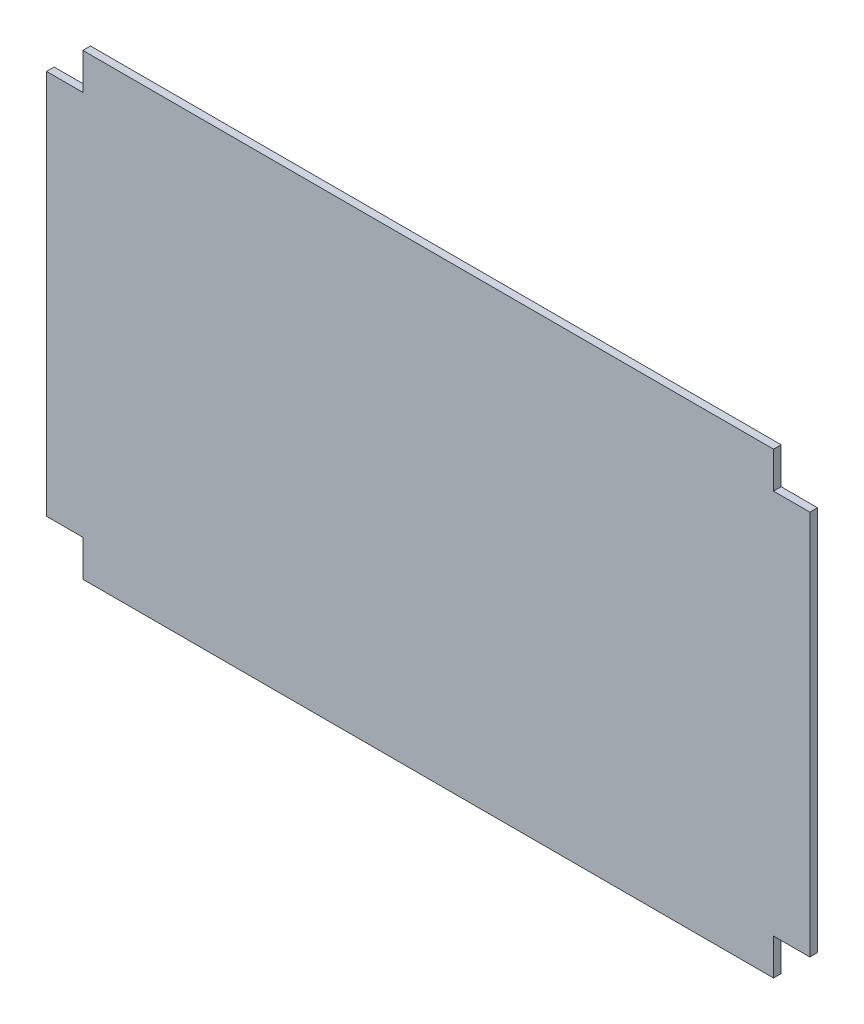
ISO-10303-21;
HEADER;
FILE_DESCRIPTION(('STEP AP214'),'2;1');
FILE_NAME('part.step','',(''),(''),'','','');
FILE_SCHEMA(('AUTOMOTIVE_DESIGN { 1 0 10303 214 1 1 1 1 }'));
ENDSEC;
DATA;
#1=APPLICATION_CONTEXT('core data for automotive mechanical design processes');
#2=APPLICATION_PROTOCOL_DEFINITION('international standard','automotive_design',2000,#1);
#3=PRODUCT_CONTEXT('',#1,'mechanical');
#4=PRODUCT('Part','Part','',(#3));
#5=PRODUCT_RELATED_PRODUCT_CATEGORY('part','',(#4));
#6=PRODUCT_DEFINITION_FORMATION('','',#4);
#7=PRODUCT_DEFINITION_CONTEXT('part definition',#1,'design');
#8=PRODUCT_DEFINITION('design','',#6,#7);
#9=PRODUCT_DEFINITION_SHAPE('','',#8);
#10=(LENGTH_UNIT() NAMED_UNIT(*) SI_UNIT(.MILLI.,.METRE.));
#11=(NAMED_UNIT(*) PLANE_ANGLE_UNIT() SI_UNIT($,.RADIAN.));
#12=(NAMED_UNIT(*) SI_UNIT($,.STERADIAN.) SOLID_ANGLE_UNIT());
#13=UNCERTAINTY_MEASURE_WITH_UNIT(LENGTH_MEASURE(1.E-05),#10,'distance_accuracy_value','');
#14=(GEOMETRIC_REPRESENTATION_CONTEXT(3) GLOBAL_UNCERTAINTY_ASSIGNED_CONTEXT((#13)) GLOBAL_UNIT_ASSIGNED_CONTEXT((#10,
#11,#12)) REPRESENTATION_CONTEXT('',''));
#15=CARTESIAN_POINT('',(0.,0.,0.));
#16=DIRECTION('',(0.,0.,1.));
#17=DIRECTION('',(1.,0.,0.));
#18=AXIS2_PLACEMENT_3D('',#15,#16,#17);
#19=CARTESIAN_POINT('',(635.,381.,12.7));
#20=DIRECTION('',(-1.,0.,0.));
#21=DIRECTION('',(0.,0.,1.));
#22=AXIS2_PLACEMENT_3D('',#19,#20,#21);
#23=PLANE('',#22);
#24=DIRECTION('',(0.,1.,0.));
#25=VECTOR('',#24,1.);
#26=CARTESIAN_POINT('',(635.,381.,12.7));
#27=LINE('',#26,#25);
#28=CARTESIAN_POINT('',(635.,-320.5,12.7));
#29=VERTEX_POINT('',#28);
#30=CARTESIAN_POINT('',(635.,320.5,12.7));
#31=VERTEX_POINT('',#30);
#32=EDGE_CURVE('E166',#29,#31,#27,.T.);
#33=ORIENTED_EDGE('',*,*,#32,.F.);
#34=DIRECTION('',(0.,0.,1.));
#35=VECTOR('',#34,1.);
#36=CARTESIAN_POINT('',(635.,-320.5,0.));
#37=LINE('',#36,#35);
#38=CARTESIAN_POINT('',(635.,-320.5,0.));
#39=VERTEX_POINT('',#38);
#40=EDGE_CURVE('E281',#39,#29,#37,.T.);
#41=ORIENTED_EDGE('',*,*,#40,.F.);
#42=DIRECTION('',(0.,1.,0.));
#43=VECTOR('',#42,1.);
#44=CARTESIAN_POINT('',(635.,381.,0.));
#45=LINE('',#44,#43);
#46=CARTESIAN_POINT('',(635.,320.5,0.));
#47=VERTEX_POINT('',#46);
#48=EDGE_CURVE('E175',#39,#47,#45,.T.);
#49=ORIENTED_EDGE('',*,*,#48,.T.);
#50=DIRECTION('',(0.,0.,1.));
#51=VECTOR('',#50,1.);
#52=CARTESIAN_POINT('',(635.,320.5,0.));
#53=LINE('',#52,#51);
#54=EDGE_CURVE('E148',#47,#31,#53,.T.);
#55=ORIENTED_EDGE('',*,*,#54,.T.);
#56=EDGE_LOOP('',(#33,#41,#49,#55));
#57=FACE_BOUND('',#56,.T.);
#58=ADVANCED_FACE('F45',(#57),#23,.F.);
#59=CARTESIAN_POINT('',(-635.,381.,12.7));
#60=DIRECTION('',(0.,-1.,0.));
#61=DIRECTION('',(0.,0.,-1.));
#62=AXIS2_PLACEMENT_3D('',#59,#60,#61);
#63=PLANE('',#62);
#64=DIRECTION('',(-1.,0.,0.));
#65=VECTOR('',#64,1.);
#66=CARTESIAN_POINT('',(-635.,381.,12.7));
#67=LINE('',#66,#65);
#68=CARTESIAN_POINT('',(574.5,381.,12.7));
#69=VERTEX_POINT('',#68);
#70=CARTESIAN_POINT('',(-574.5,381.,12.7));
#71=VERTEX_POINT('',#70);
#72=EDGE_CURVE('E156',#69,#71,#67,.T.);
#73=ORIENTED_EDGE('',*,*,#72,.F.);
#74=DIRECTION('',(0.,0.,1.));
#75=VECTOR('',#74,1.);
#76=CARTESIAN_POINT('',(574.5,381.,0.));
#77=LINE('',#76,#75);
#78=CARTESIAN_POINT('',(574.5,381.,0.));
#79=VERTEX_POINT('',#78);
#80=EDGE_CURVE('E136',#79,#69,#77,.T.);
#81=ORIENTED_EDGE('',*,*,#80,.F.);
#82=DIRECTION('',(-1.,0.,0.));
#83=VECTOR('',#82,1.);
#84=CARTESIAN_POINT('',(-635.,381.,0.));
#85=LINE('',#84,#83);
#86=CARTESIAN_POINT('',(-574.5,381.,0.));
#87=VERTEX_POINT('',#86);
#88=EDGE_CURVE('E179',#79,#87,#85,.T.);
#89=ORIENTED_EDGE('',*,*,#88,.T.);
#90=DIRECTION('',(0.,0.,1.));
#91=VECTOR('',#90,1.);
#92=CARTESIAN_POINT('',(-574.5,381.,0.));
#93=LINE('',#92,#91);
#94=EDGE_CURVE('E164',#87,#71,#93,.T.);
#95=ORIENTED_EDGE('',*,*,#94,.T.);
#96=EDGE_LOOP('',(#73,#81,#89,#95));
#97=FACE_BOUND('',#96,.T.);
#98=ADVANCED_FACE('F163',(#97),#63,.F.);
#99=CARTESIAN_POINT('',(-635.,381.,12.7));
#100=DIRECTION('',(1.,0.,0.));
#101=DIRECTION('',(0.,1.,0.));
#102=AXIS2_PLACEMENT_3D('',#99,#100,#101);
#103=PLANE('',#102);
#104=DIRECTION('',(0.,-1.,0.));
#105=VECTOR('',#104,1.);
#106=CARTESIAN_POINT('',(-635.,381.,0.));
#107=LINE('',#106,#105);
#108=CARTESIAN_POINT('',(-635.,320.5,0.));
#109=VERTEX_POINT('',#108);
#110=CARTESIAN_POINT('',(-635.,-320.5,0.));
#111=VERTEX_POINT('',#110);
#112=EDGE_CURVE('E181',#109,#111,#107,.T.);
#113=ORIENTED_EDGE('',*,*,#112,.T.);
#114=DIRECTION('',(0.,0.,1.));
#115=VECTOR('',#114,1.);
#116=CARTESIAN_POINT('',(-635.,-320.5,0.));
#117=LINE('',#116,#115);
#118=CARTESIAN_POINT('',(-635.,-320.5,12.7));
#119=VERTEX_POINT('',#118);
#120=EDGE_CURVE('E220',#111,#119,#117,.T.);
#121=ORIENTED_EDGE('',*,*,#120,.T.);
#122=DIRECTION('',(0.,-1.,0.));
#123=VECTOR('',#122,1.);
#124=CARTESIAN_POINT('',(-635.,381.,12.7));
#125=LINE('',#124,#123);
#126=CARTESIAN_POINT('',(-635.,320.5,12.7));
#127=VERTEX_POINT('',#126);
#128=EDGE_CURVE('E54',#127,#119,#125,.T.);
#129=ORIENTED_EDGE('',*,*,#128,.F.);
#130=DIRECTION('',(0.,0.,1.));
#131=VECTOR('',#130,1.);
#132=CARTESIAN_POINT('',(-635.,320.5,0.));
#133=LINE('',#132,#131);
#134=EDGE_CURVE('E244',#109,#127,#133,.T.);
#135=ORIENTED_EDGE('',*,*,#134,.F.);
#136=EDGE_LOOP('',(#113,#121,#129,#135));
#137=FACE_BOUND('',#136,.T.);
#138=ADVANCED_FACE('F260',(#137),#103,.F.);
#139=CARTESIAN_POINT('',(-635.,-381.,12.7));
#140=DIRECTION('',(0.,1.,0.));
#141=DIRECTION('',(0.,0.,1.));
#142=AXIS2_PLACEMENT_3D('',#139,#140,#141);
#143=PLANE('',#142);
#144=DIRECTION('',(1.,0.,0.));
#145=VECTOR('',#144,1.);
#146=CARTESIAN_POINT('',(-635.,-381.,12.7));
#147=LINE('',#146,#145);
#148=CARTESIAN_POINT('',(-574.5,-381.,12.7));
#149=VERTEX_POINT('',#148);
#150=CARTESIAN_POINT('',(574.5,-381.,12.7));
#151=VERTEX_POINT('',#150);
#152=EDGE_CURVE('E11',#149,#151,#147,.T.);
#153=ORIENTED_EDGE('',*,*,#152,.F.);
#154=DIRECTION('',(0.,0.,1.));
#155=VECTOR('',#154,1.);
#156=CARTESIAN_POINT('',(-574.5,-381.,0.));
#157=LINE('',#156,#155);
#158=CARTESIAN_POINT('',(-574.5,-381.,0.));
#159=VERTEX_POINT('',#158);
#160=EDGE_CURVE('E197',#159,#149,#157,.T.);
#161=ORIENTED_EDGE('',*,*,#160,.F.);
#162=DIRECTION('',(1.,0.,0.));
#163=VECTOR('',#162,1.);
#164=CARTESIAN_POINT('',(-635.,-381.,0.));
#165=LINE('',#164,#163);
#166=CARTESIAN_POINT('',(574.5,-381.,0.));
#167=VERTEX_POINT('',#166);
#168=EDGE_CURVE('E48',#159,#167,#165,.T.);
#169=ORIENTED_EDGE('',*,*,#168,.T.);
#170=DIRECTION('',(0.,0.,1.));
#171=VECTOR('',#170,1.);
#172=CARTESIAN_POINT('',(574.5,-381.,0.));
#173=LINE('',#172,#171);
#174=EDGE_CURVE('E196',#167,#151,#173,.T.);
#175=ORIENTED_EDGE('',*,*,#174,.T.);
#176=EDGE_LOOP('',(#153,#161,#169,#175));
#177=FACE_BOUND('',#176,.T.);
#178=ADVANCED_FACE('F195',(#177),#143,.F.);
#179=CARTESIAN_POINT('',(0.,0.,12.7));
#180=DIRECTION('',(0.,0.,1.));
#181=DIRECTION('',(1.,0.,0.));
#182=AXIS2_PLACEMENT_3D('',#179,#180,#181);
#183=PLANE('',#182);
#184=DIRECTION('',(-1.,0.,0.));
#185=VECTOR('',#184,1.);
#186=CARTESIAN_POINT('',(-635.,-320.5,12.7));
#187=LINE('',#186,#185);
#188=CARTESIAN_POINT('',(-574.5,-320.5,12.7));
#189=VERTEX_POINT('',#188);
#190=EDGE_CURVE('E223',#189,#119,#187,.T.);
#191=ORIENTED_EDGE('',*,*,#190,.F.);
#192=DIRECTION('',(0.,1.,0.));
#193=VECTOR('',#192,1.);
#194=CARTESIAN_POINT('',(-574.5,-320.5,12.7));
#195=LINE('',#194,#193);
#196=EDGE_CURVE('E226',#149,#189,#195,.T.);
#197=ORIENTED_EDGE('',*,*,#196,.F.);
#198=ORIENTED_EDGE('',*,*,#152,.T.);
#199=DIRECTION('',(0.,-1.,0.));
#200=VECTOR('',#199,1.);
#201=CARTESIAN_POINT('',(574.5,-381.,12.7));
#202=LINE('',#201,#200);
#203=CARTESIAN_POINT('',(574.5,-320.5,12.7));
#204=VERTEX_POINT('',#203);
#205=EDGE_CURVE('E149',#204,#151,#202,.T.);
#206=ORIENTED_EDGE('',*,*,#205,.F.);
#207=DIRECTION('',(-1.,0.,0.));
#208=VECTOR('',#207,1.);
#209=CARTESIAN_POINT('',(574.5,-320.5,12.7));
#210=LINE('',#209,#208);
#211=EDGE_CURVE('E206',#29,#204,#210,.T.);
#212=ORIENTED_EDGE('',*,*,#211,.F.);
#213=ORIENTED_EDGE('',*,*,#32,.T.);
#214=DIRECTION('',(1.,0.,0.));
#215=VECTOR('',#214,1.);
#216=CARTESIAN_POINT('',(574.5,320.5,12.7));
#217=LINE('',#216,#215);
#218=CARTESIAN_POINT('',(574.5,320.5,12.7));
#219=VERTEX_POINT('',#218);
#220=EDGE_CURVE('E158',#219,#31,#217,.T.);
#221=ORIENTED_EDGE('',*,*,#220,.F.);
#222=DIRECTION('',(0.,-1.,0.));
#223=VECTOR('',#222,1.);
#224=CARTESIAN_POINT('',(574.5,381.,12.7));
#225=LINE('',#224,#223);
#226=EDGE_CURVE('E139',#69,#219,#225,.T.);
#227=ORIENTED_EDGE('',*,*,#226,.F.);
#228=ORIENTED_EDGE('',*,*,#72,.T.);
#229=DIRECTION('',(0.,1.,0.));
#230=VECTOR('',#229,1.);
#231=CARTESIAN_POINT('',(-574.5,320.5,12.7));
#232=LINE('',#231,#230);
#233=CARTESIAN_POINT('',(-574.5,320.5,12.7));
#234=VERTEX_POINT('',#233);
#235=EDGE_CURVE('E240',#234,#71,#232,.T.);
#236=ORIENTED_EDGE('',*,*,#235,.F.);
#237=DIRECTION('',(1.,0.,0.));
#238=VECTOR('',#237,1.);
#239=CARTESIAN_POINT('',(-635.,320.5,12.7));
#240=LINE('',#239,#238);
#241=EDGE_CURVE('E160',#127,#234,#240,.T.);
#242=ORIENTED_EDGE('',*,*,#241,.F.);
#243=ORIENTED_EDGE('',*,*,#128,.T.);
#244=EDGE_LOOP('',(#191,#197,#198,#206,#212,#213,#221,#227,#228,#236,#242,#243));
#245=FACE_BOUND('',#244,.T.);
#246=ADVANCED_FACE('F154',(#245),#183,.T.);
#247=CARTESIAN_POINT('',(0.,0.,0.));
#248=DIRECTION('',(0.,0.,1.));
#249=DIRECTION('',(1.,0.,0.));
#250=AXIS2_PLACEMENT_3D('',#247,#248,#249);
#251=PLANE('',#250);
#252=DIRECTION('',(0.,1.,0.));
#253=VECTOR('',#252,1.);
#254=CARTESIAN_POINT('',(-574.5,-320.5,0.));
#255=LINE('',#254,#253);
#256=CARTESIAN_POINT('',(-574.5,-320.5,0.));
#257=VERTEX_POINT('',#256);
#258=EDGE_CURVE('E201',#159,#257,#255,.T.);
#259=ORIENTED_EDGE('',*,*,#258,.T.);
#260=DIRECTION('',(-1.,0.,0.));
#261=VECTOR('',#260,1.);
#262=CARTESIAN_POINT('',(-635.,-320.5,0.));
#263=LINE('',#262,#261);
#264=EDGE_CURVE('E62',#257,#111,#263,.T.);
#265=ORIENTED_EDGE('',*,*,#264,.T.);
#266=ORIENTED_EDGE('',*,*,#112,.F.);
#267=DIRECTION('',(1.,0.,0.));
#268=VECTOR('',#267,1.);
#269=CARTESIAN_POINT('',(-635.,320.5,0.));
#270=LINE('',#269,#268);
#271=CARTESIAN_POINT('',(-574.5,320.5,0.));
#272=VERTEX_POINT('',#271);
#273=EDGE_CURVE('E235',#109,#272,#270,.T.);
#274=ORIENTED_EDGE('',*,*,#273,.T.);
#275=DIRECTION('',(0.,1.,0.));
#276=VECTOR('',#275,1.);
#277=CARTESIAN_POINT('',(-574.5,320.5,0.));
#278=LINE('',#277,#276);
#279=EDGE_CURVE('E239',#272,#87,#278,.T.);
#280=ORIENTED_EDGE('',*,*,#279,.T.);
#281=ORIENTED_EDGE('',*,*,#88,.F.);
#282=DIRECTION('',(0.,-1.,0.));
#283=VECTOR('',#282,1.);
#284=CARTESIAN_POINT('',(574.5,381.,0.));
#285=LINE('',#284,#283);
#286=CARTESIAN_POINT('',(574.5,320.5,0.));
#287=VERTEX_POINT('',#286);
#288=EDGE_CURVE('E142',#79,#287,#285,.T.);
#289=ORIENTED_EDGE('',*,*,#288,.T.);
#290=DIRECTION('',(1.,0.,0.));
#291=VECTOR('',#290,1.);
#292=CARTESIAN_POINT('',(574.5,320.5,0.));
#293=LINE('',#292,#291);
#294=EDGE_CURVE('E403',#287,#47,#293,.T.);
#295=ORIENTED_EDGE('',*,*,#294,.T.);
#296=ORIENTED_EDGE('',*,*,#48,.F.);
#297=DIRECTION('',(-1.,0.,0.));
#298=VECTOR('',#297,1.);
#299=CARTESIAN_POINT('',(574.5,-320.5,0.));
#300=LINE('',#299,#298);
#301=CARTESIAN_POINT('',(574.5,-320.5,0.));
#302=VERTEX_POINT('',#301);
#303=EDGE_CURVE('E204',#39,#302,#300,.T.);
#304=ORIENTED_EDGE('',*,*,#303,.T.);
#305=DIRECTION('',(0.,-1.,0.));
#306=VECTOR('',#305,1.);
#307=CARTESIAN_POINT('',(574.5,-381.,0.));
#308=LINE('',#307,#306);
#309=EDGE_CURVE('E70',#302,#167,#308,.T.);
#310=ORIENTED_EDGE('',*,*,#309,.T.);
#311=ORIENTED_EDGE('',*,*,#168,.F.);
#312=EDGE_LOOP('',(#259,#265,#266,#274,#280,#281,#289,#295,#296,#304,#310,#311));
#313=FACE_BOUND('',#312,.T.);
#314=ADVANCED_FACE('F200',(#313),#251,.F.);
#315=CARTESIAN_POINT('',(-574.5,320.5,0.));
#316=DIRECTION('',(1.,0.,0.));
#317=DIRECTION('',(0.,0.,-1.));
#318=AXIS2_PLACEMENT_3D('',#315,#316,#317);
#319=PLANE('',#318);
#320=ORIENTED_EDGE('',*,*,#235,.T.);
#321=ORIENTED_EDGE('',*,*,#94,.F.);
#322=ORIENTED_EDGE('',*,*,#279,.F.);
#323=DIRECTION('',(0.,0.,1.));
#324=VECTOR('',#323,1.);
#325=CARTESIAN_POINT('',(-574.5,320.5,0.));
#326=LINE('',#325,#324);
#327=EDGE_CURVE('E252',#272,#234,#326,.T.);
#328=ORIENTED_EDGE('',*,*,#327,.T.);
#329=EDGE_LOOP('',(#320,#321,#322,#328));
#330=FACE_BOUND('',#329,.T.);
#331=ADVANCED_FACE('F263',(#330),#319,.F.);
#332=CARTESIAN_POINT('',(-635.,320.5,0.));
#333=DIRECTION('',(0.,-1.,0.));
#334=DIRECTION('',(0.,0.,-1.));
#335=AXIS2_PLACEMENT_3D('',#332,#333,#334);
#336=PLANE('',#335);
#337=ORIENTED_EDGE('',*,*,#241,.T.);
#338=ORIENTED_EDGE('',*,*,#327,.F.);
#339=ORIENTED_EDGE('',*,*,#273,.F.);
#340=ORIENTED_EDGE('',*,*,#134,.T.);
#341=EDGE_LOOP('',(#337,#338,#339,#340));
#342=FACE_BOUND('',#341,.T.);
#343=ADVANCED_FACE('F257',(#342),#336,.F.);
#344=CARTESIAN_POINT('',(574.5,381.,0.));
#345=DIRECTION('',(-1.,0.,0.));
#346=DIRECTION('',(0.,0.,1.));
#347=AXIS2_PLACEMENT_3D('',#344,#345,#346);
#348=PLANE('',#347);
#349=ORIENTED_EDGE('',*,*,#226,.T.);
#350=DIRECTION('',(0.,0.,1.));
#351=VECTOR('',#350,1.);
#352=CARTESIAN_POINT('',(574.5,320.5,0.));
#353=LINE('',#352,#351);
#354=EDGE_CURVE('E399',#287,#219,#353,.T.);
#355=ORIENTED_EDGE('',*,*,#354,.F.);
#356=ORIENTED_EDGE('',*,*,#288,.F.);
#357=ORIENTED_EDGE('',*,*,#80,.T.);
#358=EDGE_LOOP('',(#349,#355,#356,#357));
#359=FACE_BOUND('',#358,.T.);
#360=ADVANCED_FACE('F138',(#359),#348,.F.);
#361=CARTESIAN_POINT('',(574.5,320.5,0.));
#362=DIRECTION('',(0.,-1.,0.));
#363=DIRECTION('',(0.,0.,-1.));
#364=AXIS2_PLACEMENT_3D('',#361,#362,#363);
#365=PLANE('',#364);
#366=ORIENTED_EDGE('',*,*,#220,.T.);
#367=ORIENTED_EDGE('',*,*,#54,.F.);
#368=ORIENTED_EDGE('',*,*,#294,.F.);
#369=ORIENTED_EDGE('',*,*,#354,.T.);
#370=EDGE_LOOP('',(#366,#367,#368,#369));
#371=FACE_BOUND('',#370,.T.);
#372=ADVANCED_FACE('F296',(#371),#365,.F.);
#373=CARTESIAN_POINT('',(574.5,-381.,0.));
#374=DIRECTION('',(-1.,0.,0.));
#375=DIRECTION('',(0.,-1.,0.));
#376=AXIS2_PLACEMENT_3D('',#373,#374,#375);
#377=PLANE('',#376);
#378=ORIENTED_EDGE('',*,*,#205,.T.);
#379=ORIENTED_EDGE('',*,*,#174,.F.);
#380=ORIENTED_EDGE('',*,*,#309,.F.);
#381=DIRECTION('',(0.,0.,1.));
#382=VECTOR('',#381,1.);
#383=CARTESIAN_POINT('',(574.5,-320.5,0.));
#384=LINE('',#383,#382);
#385=EDGE_CURVE('E230',#302,#204,#384,.T.);
#386=ORIENTED_EDGE('',*,*,#385,.T.);
#387=EDGE_LOOP('',(#378,#379,#380,#386));
#388=FACE_BOUND('',#387,.T.);
#389=ADVANCED_FACE('F294',(#388),#377,.F.);
#390=CARTESIAN_POINT('',(574.5,-320.5,0.));
#391=DIRECTION('',(0.,1.,0.));
#392=DIRECTION('',(0.,0.,1.));
#393=AXIS2_PLACEMENT_3D('',#390,#391,#392);
#394=PLANE('',#393);
#395=ORIENTED_EDGE('',*,*,#211,.T.);
#396=ORIENTED_EDGE('',*,*,#385,.F.);
#397=ORIENTED_EDGE('',*,*,#303,.F.);
#398=ORIENTED_EDGE('',*,*,#40,.T.);
#399=EDGE_LOOP('',(#395,#396,#397,#398));
#400=FACE_BOUND('',#399,.T.);
#401=ADVANCED_FACE('F285',(#400),#394,.F.);
#402=CARTESIAN_POINT('',(-635.,-320.5,0.));
#403=DIRECTION('',(0.,1.,0.));
#404=DIRECTION('',(0.,0.,1.));
#405=AXIS2_PLACEMENT_3D('',#402,#403,#404);
#406=PLANE('',#405);
#407=ORIENTED_EDGE('',*,*,#190,.T.);
#408=ORIENTED_EDGE('',*,*,#120,.F.);
#409=ORIENTED_EDGE('',*,*,#264,.F.);
#410=DIRECTION('',(0.,0.,1.));
#411=VECTOR('',#410,1.);
#412=CARTESIAN_POINT('',(-574.5,-320.5,0.));
#413=LINE('',#412,#411);
#414=EDGE_CURVE('E217',#257,#189,#413,.T.);
#415=ORIENTED_EDGE('',*,*,#414,.T.);
#416=EDGE_LOOP('',(#407,#408,#409,#415));
#417=FACE_BOUND('',#416,.T.);
#418=ADVANCED_FACE('F261',(#417),#406,.F.);
#419=CARTESIAN_POINT('',(-574.5,-320.5,0.));
#420=DIRECTION('',(1.,0.,0.));
#421=DIRECTION('',(0.,0.,-1.));
#422=AXIS2_PLACEMENT_3D('',#419,#420,#421);
#423=PLANE('',#422);
#424=ORIENTED_EDGE('',*,*,#196,.T.);
#425=ORIENTED_EDGE('',*,*,#414,.F.);
#426=ORIENTED_EDGE('',*,*,#258,.F.);
#427=ORIENTED_EDGE('',*,*,#160,.T.);
#428=EDGE_LOOP('',(#424,#425,#426,#427));
#429=FACE_BOUND('',#428,.T.);
#430=ADVANCED_FACE('F307',(#429),#423,.F.);
#431=CLOSED_SHELL('',(#58,#98,#138,#178,#246,#314,#331,#343,#360,#372,#389,#401,#418,#430));
#432=MANIFOLD_SOLID_BREP('B2',#431);
#433=ADVANCED_BREP_SHAPE_REPRESENTATION('',(#18,#432),#14);
#434=SHAPE_DEFINITION_REPRESENTATION(#9,#433);
ENDSEC;
END-ISO-10303-21;
